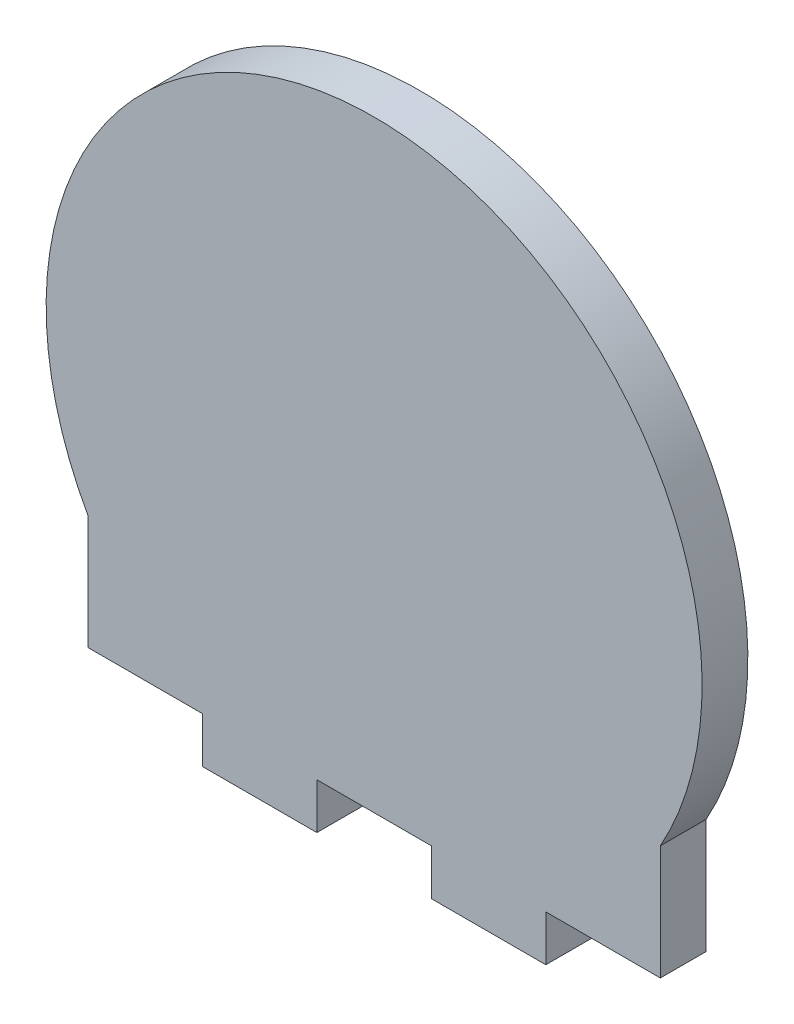
ISO-10303-21;
HEADER;
FILE_DESCRIPTION(('STEP AP214'),'2;1');
FILE_NAME('part.step','',(''),(''),'','','');
FILE_SCHEMA(('AUTOMOTIVE_DESIGN { 1 0 10303 214 1 1 1 1 }'));
ENDSEC;
DATA;
#1=APPLICATION_CONTEXT('core data for automotive mechanical design processes');
#2=APPLICATION_PROTOCOL_DEFINITION('international standard','automotive_design',2000,#1);
#3=PRODUCT_CONTEXT('',#1,'mechanical');
#4=PRODUCT('Part','Part','',(#3));
#5=PRODUCT_RELATED_PRODUCT_CATEGORY('part','',(#4));
#6=PRODUCT_DEFINITION_FORMATION('','',#4);
#7=PRODUCT_DEFINITION_CONTEXT('part definition',#1,'design');
#8=PRODUCT_DEFINITION('design','',#6,#7);
#9=PRODUCT_DEFINITION_SHAPE('','',#8);
#10=(LENGTH_UNIT() NAMED_UNIT(*) SI_UNIT(.MILLI.,.METRE.));
#11=(NAMED_UNIT(*) PLANE_ANGLE_UNIT() SI_UNIT($,.RADIAN.));
#12=(NAMED_UNIT(*) SI_UNIT($,.STERADIAN.) SOLID_ANGLE_UNIT());
#13=UNCERTAINTY_MEASURE_WITH_UNIT(LENGTH_MEASURE(1.E-05),#10,'distance_accuracy_value','');
#14=(GEOMETRIC_REPRESENTATION_CONTEXT(3) GLOBAL_UNCERTAINTY_ASSIGNED_CONTEXT((#13)) GLOBAL_UNIT_ASSIGNED_CONTEXT((#10,
#11,#12)) REPRESENTATION_CONTEXT('',''));
#15=CARTESIAN_POINT('',(0.,0.,0.));
#16=DIRECTION('',(0.,0.,1.));
#17=DIRECTION('',(1.,0.,0.));
#18=AXIS2_PLACEMENT_3D('',#15,#16,#17);
#19=CARTESIAN_POINT('',(0.,10.,4.));
#20=DIRECTION('',(1.,0.,0.));
#21=DIRECTION('',(0.,1.,0.));
#22=AXIS2_PLACEMENT_3D('',#19,#20,#21);
#23=PLANE('',#22);
#24=DIRECTION('',(0.,-1.,0.));
#25=VECTOR('',#24,1.);
#26=CARTESIAN_POINT('',(0.,10.,0.));
#27=LINE('',#26,#25);
#28=CARTESIAN_POINT('',(0.,10.,0.));
#29=VERTEX_POINT('',#28);
#30=CARTESIAN_POINT('',(0.,0.,0.));
#31=VERTEX_POINT('',#30);
#32=EDGE_CURVE('E151',#29,#31,#27,.T.);
#33=ORIENTED_EDGE('',*,*,#32,.T.);
#34=DIRECTION('',(0.,0.,-1.));
#35=VECTOR('',#34,1.);
#36=CARTESIAN_POINT('',(0.,0.,4.));
#37=LINE('',#36,#35);
#38=CARTESIAN_POINT('',(0.,0.,4.));
#39=VERTEX_POINT('',#38);
#40=EDGE_CURVE('E11',#39,#31,#37,.T.);
#41=ORIENTED_EDGE('',*,*,#40,.F.);
#42=DIRECTION('',(0.,-1.,0.));
#43=VECTOR('',#42,1.);
#44=CARTESIAN_POINT('',(0.,10.,4.));
#45=LINE('',#44,#43);
#46=CARTESIAN_POINT('',(0.,10.,4.));
#47=VERTEX_POINT('',#46);
#48=EDGE_CURVE('E173',#47,#39,#45,.T.);
#49=ORIENTED_EDGE('',*,*,#48,.F.);
#50=DIRECTION('',(0.,0.,-1.));
#51=VECTOR('',#50,1.);
#52=CARTESIAN_POINT('',(0.,10.,4.));
#53=LINE('',#52,#51);
#54=EDGE_CURVE('E147',#47,#29,#53,.T.);
#55=ORIENTED_EDGE('',*,*,#54,.T.);
#56=EDGE_LOOP('',(#33,#41,#49,#55));
#57=FACE_BOUND('',#56,.T.);
#58=ADVANCED_FACE('F31',(#57),#23,.F.);
#59=CARTESIAN_POINT('',(0.,0.,4.));
#60=DIRECTION('',(0.,1.,0.));
#61=DIRECTION('',(0.,0.,1.));
#62=AXIS2_PLACEMENT_3D('',#59,#60,#61);
#63=PLANE('',#62);
#64=DIRECTION('',(1.,0.,0.));
#65=VECTOR('',#64,1.);
#66=CARTESIAN_POINT('',(0.,0.,0.));
#67=LINE('',#66,#65);
#68=CARTESIAN_POINT('',(10.,0.,0.));
#69=VERTEX_POINT('',#68);
#70=EDGE_CURVE('E154',#31,#69,#67,.T.);
#71=ORIENTED_EDGE('',*,*,#70,.T.);
#72=DIRECTION('',(0.,0.,-1.));
#73=VECTOR('',#72,1.);
#74=CARTESIAN_POINT('',(10.,0.,4.));
#75=LINE('',#74,#73);
#76=CARTESIAN_POINT('',(10.,0.,4.));
#77=VERTEX_POINT('',#76);
#78=EDGE_CURVE('E39',#77,#69,#75,.T.);
#79=ORIENTED_EDGE('',*,*,#78,.F.);
#80=DIRECTION('',(1.,0.,0.));
#81=VECTOR('',#80,1.);
#82=CARTESIAN_POINT('',(0.,0.,4.));
#83=LINE('',#82,#81);
#84=EDGE_CURVE('E102',#39,#77,#83,.T.);
#85=ORIENTED_EDGE('',*,*,#84,.F.);
#86=ORIENTED_EDGE('',*,*,#40,.T.);
#87=EDGE_LOOP('',(#71,#79,#85,#86));
#88=FACE_BOUND('',#87,.T.);
#89=ADVANCED_FACE('F251',(#88),#63,.F.);
#90=CARTESIAN_POINT('',(10.,0.,4.));
#91=DIRECTION('',(1.,0.,0.));
#92=DIRECTION('',(0.,1.,0.));
#93=AXIS2_PLACEMENT_3D('',#90,#91,#92);
#94=PLANE('',#93);
#95=DIRECTION('',(0.,-1.,0.));
#96=VECTOR('',#95,1.);
#97=CARTESIAN_POINT('',(10.,0.,0.));
#98=LINE('',#97,#96);
#99=CARTESIAN_POINT('',(10.,-4.,0.));
#100=VERTEX_POINT('',#99);
#101=EDGE_CURVE('E156',#69,#100,#98,.T.);
#102=ORIENTED_EDGE('',*,*,#101,.T.);
#103=DIRECTION('',(0.,0.,-1.));
#104=VECTOR('',#103,1.);
#105=CARTESIAN_POINT('',(10.,-4.,4.));
#106=LINE('',#105,#104);
#107=CARTESIAN_POINT('',(10.,-4.,4.));
#108=VERTEX_POINT('',#107);
#109=EDGE_CURVE('E192',#108,#100,#106,.T.);
#110=ORIENTED_EDGE('',*,*,#109,.F.);
#111=DIRECTION('',(0.,-1.,0.));
#112=VECTOR('',#111,1.);
#113=CARTESIAN_POINT('',(10.,0.,4.));
#114=LINE('',#113,#112);
#115=EDGE_CURVE('E200',#77,#108,#114,.T.);
#116=ORIENTED_EDGE('',*,*,#115,.F.);
#117=ORIENTED_EDGE('',*,*,#78,.T.);
#118=EDGE_LOOP('',(#102,#110,#116,#117));
#119=FACE_BOUND('',#118,.T.);
#120=ADVANCED_FACE('F198',(#119),#94,.F.);
#121=CARTESIAN_POINT('',(10.,-4.,4.));
#122=DIRECTION('',(0.,1.,0.));
#123=DIRECTION('',(0.,0.,1.));
#124=AXIS2_PLACEMENT_3D('',#121,#122,#123);
#125=PLANE('',#124);
#126=DIRECTION('',(1.,0.,0.));
#127=VECTOR('',#126,1.);
#128=CARTESIAN_POINT('',(10.,-4.,0.));
#129=LINE('',#128,#127);
#130=CARTESIAN_POINT('',(20.,-4.,0.));
#131=VERTEX_POINT('',#130);
#132=EDGE_CURVE('E158',#100,#131,#129,.T.);
#133=ORIENTED_EDGE('',*,*,#132,.T.);
#134=DIRECTION('',(0.,0.,-1.));
#135=VECTOR('',#134,1.);
#136=CARTESIAN_POINT('',(20.,-4.,4.));
#137=LINE('',#136,#135);
#138=CARTESIAN_POINT('',(20.,-4.,4.));
#139=VERTEX_POINT('',#138);
#140=EDGE_CURVE('E189',#139,#131,#137,.T.);
#141=ORIENTED_EDGE('',*,*,#140,.F.);
#142=DIRECTION('',(1.,0.,0.));
#143=VECTOR('',#142,1.);
#144=CARTESIAN_POINT('',(10.,-4.,4.));
#145=LINE('',#144,#143);
#146=EDGE_CURVE('E218',#108,#139,#145,.T.);
#147=ORIENTED_EDGE('',*,*,#146,.F.);
#148=ORIENTED_EDGE('',*,*,#109,.T.);
#149=EDGE_LOOP('',(#133,#141,#147,#148));
#150=FACE_BOUND('',#149,.T.);
#151=ADVANCED_FACE('F209',(#150),#125,.F.);
#152=CARTESIAN_POINT('',(20.,-4.,4.));
#153=DIRECTION('',(-1.,0.,0.));
#154=DIRECTION('',(0.,0.,1.));
#155=AXIS2_PLACEMENT_3D('',#152,#153,#154);
#156=PLANE('',#155);
#157=DIRECTION('',(0.,1.,0.));
#158=VECTOR('',#157,1.);
#159=CARTESIAN_POINT('',(20.,-4.,0.));
#160=LINE('',#159,#158);
#161=CARTESIAN_POINT('',(20.,0.,0.));
#162=VERTEX_POINT('',#161);
#163=EDGE_CURVE('E160',#131,#162,#160,.T.);
#164=ORIENTED_EDGE('',*,*,#163,.T.);
#165=DIRECTION('',(0.,0.,-1.));
#166=VECTOR('',#165,1.);
#167=CARTESIAN_POINT('',(20.,0.,4.));
#168=LINE('',#167,#166);
#169=CARTESIAN_POINT('',(20.,0.,4.));
#170=VERTEX_POINT('',#169);
#171=EDGE_CURVE('E186',#170,#162,#168,.T.);
#172=ORIENTED_EDGE('',*,*,#171,.F.);
#173=DIRECTION('',(0.,1.,0.));
#174=VECTOR('',#173,1.);
#175=CARTESIAN_POINT('',(20.,-4.,4.));
#176=LINE('',#175,#174);
#177=EDGE_CURVE('E215',#139,#170,#176,.T.);
#178=ORIENTED_EDGE('',*,*,#177,.F.);
#179=ORIENTED_EDGE('',*,*,#140,.T.);
#180=EDGE_LOOP('',(#164,#172,#178,#179));
#181=FACE_BOUND('',#180,.T.);
#182=ADVANCED_FACE('F213',(#181),#156,.F.);
#183=CARTESIAN_POINT('',(20.,0.,4.));
#184=DIRECTION('',(0.,1.,0.));
#185=DIRECTION('',(0.,0.,1.));
#186=AXIS2_PLACEMENT_3D('',#183,#184,#185);
#187=PLANE('',#186);
#188=DIRECTION('',(1.,0.,0.));
#189=VECTOR('',#188,1.);
#190=CARTESIAN_POINT('',(20.,0.,0.));
#191=LINE('',#190,#189);
#192=CARTESIAN_POINT('',(30.,0.,0.));
#193=VERTEX_POINT('',#192);
#194=EDGE_CURVE('E162',#162,#193,#191,.T.);
#195=ORIENTED_EDGE('',*,*,#194,.T.);
#196=DIRECTION('',(0.,0.,-1.));
#197=VECTOR('',#196,1.);
#198=CARTESIAN_POINT('',(30.,0.,4.));
#199=LINE('',#198,#197);
#200=CARTESIAN_POINT('',(30.,0.,4.));
#201=VERTEX_POINT('',#200);
#202=EDGE_CURVE('E183',#201,#193,#199,.T.);
#203=ORIENTED_EDGE('',*,*,#202,.F.);
#204=DIRECTION('',(1.,0.,0.));
#205=VECTOR('',#204,1.);
#206=CARTESIAN_POINT('',(20.,0.,4.));
#207=LINE('',#206,#205);
#208=EDGE_CURVE('E217',#170,#201,#207,.T.);
#209=ORIENTED_EDGE('',*,*,#208,.F.);
#210=ORIENTED_EDGE('',*,*,#171,.T.);
#211=EDGE_LOOP('',(#195,#203,#209,#210));
#212=FACE_BOUND('',#211,.T.);
#213=ADVANCED_FACE('F264',(#212),#187,.F.);
#214=CARTESIAN_POINT('',(30.,0.,4.));
#215=DIRECTION('',(1.,0.,0.));
#216=DIRECTION('',(0.,0.,-1.));
#217=AXIS2_PLACEMENT_3D('',#214,#215,#216);
#218=PLANE('',#217);
#219=DIRECTION('',(0.,-1.,0.));
#220=VECTOR('',#219,1.);
#221=CARTESIAN_POINT('',(30.,0.,0.));
#222=LINE('',#221,#220);
#223=CARTESIAN_POINT('',(30.,-4.,0.));
#224=VERTEX_POINT('',#223);
#225=EDGE_CURVE('E164',#193,#224,#222,.T.);
#226=ORIENTED_EDGE('',*,*,#225,.T.);
#227=DIRECTION('',(0.,0.,-1.));
#228=VECTOR('',#227,1.);
#229=CARTESIAN_POINT('',(30.,-4.,4.));
#230=LINE('',#229,#228);
#231=CARTESIAN_POINT('',(30.,-4.,4.));
#232=VERTEX_POINT('',#231);
#233=EDGE_CURVE('E180',#232,#224,#230,.T.);
#234=ORIENTED_EDGE('',*,*,#233,.F.);
#235=DIRECTION('',(0.,-1.,0.));
#236=VECTOR('',#235,1.);
#237=CARTESIAN_POINT('',(30.,0.,4.));
#238=LINE('',#237,#236);
#239=EDGE_CURVE('E220',#201,#232,#238,.T.);
#240=ORIENTED_EDGE('',*,*,#239,.F.);
#241=ORIENTED_EDGE('',*,*,#202,.T.);
#242=EDGE_LOOP('',(#226,#234,#240,#241));
#243=FACE_BOUND('',#242,.T.);
#244=ADVANCED_FACE('F267',(#243),#218,.F.);
#245=CARTESIAN_POINT('',(30.,-4.,4.));
#246=DIRECTION('',(0.,1.,0.));
#247=DIRECTION('',(0.,0.,1.));
#248=AXIS2_PLACEMENT_3D('',#245,#246,#247);
#249=PLANE('',#248);
#250=DIRECTION('',(1.,0.,0.));
#251=VECTOR('',#250,1.);
#252=CARTESIAN_POINT('',(30.,-4.,0.));
#253=LINE('',#252,#251);
#254=CARTESIAN_POINT('',(40.,-4.,0.));
#255=VERTEX_POINT('',#254);
#256=EDGE_CURVE('E166',#224,#255,#253,.T.);
#257=ORIENTED_EDGE('',*,*,#256,.T.);
#258=DIRECTION('',(0.,0.,-1.));
#259=VECTOR('',#258,1.);
#260=CARTESIAN_POINT('',(40.,-4.,4.));
#261=LINE('',#260,#259);
#262=CARTESIAN_POINT('',(40.,-4.,4.));
#263=VERTEX_POINT('',#262);
#264=EDGE_CURVE('E177',#263,#255,#261,.T.);
#265=ORIENTED_EDGE('',*,*,#264,.F.);
#266=DIRECTION('',(1.,0.,0.));
#267=VECTOR('',#266,1.);
#268=CARTESIAN_POINT('',(30.,-4.,4.));
#269=LINE('',#268,#267);
#270=EDGE_CURVE('E226',#232,#263,#269,.T.);
#271=ORIENTED_EDGE('',*,*,#270,.F.);
#272=ORIENTED_EDGE('',*,*,#233,.T.);
#273=EDGE_LOOP('',(#257,#265,#271,#272));
#274=FACE_BOUND('',#273,.T.);
#275=ADVANCED_FACE('F232',(#274),#249,.F.);
#276=CARTESIAN_POINT('',(40.,-4.,4.));
#277=DIRECTION('',(-1.,0.,0.));
#278=DIRECTION('',(0.,0.,1.));
#279=AXIS2_PLACEMENT_3D('',#276,#277,#278);
#280=PLANE('',#279);
#281=DIRECTION('',(0.,1.,0.));
#282=VECTOR('',#281,1.);
#283=CARTESIAN_POINT('',(40.,-4.,0.));
#284=LINE('',#283,#282);
#285=CARTESIAN_POINT('',(40.,0.,0.));
#286=VERTEX_POINT('',#285);
#287=EDGE_CURVE('E168',#255,#286,#284,.T.);
#288=ORIENTED_EDGE('',*,*,#287,.T.);
#289=DIRECTION('',(0.,0.,-1.));
#290=VECTOR('',#289,1.);
#291=CARTESIAN_POINT('',(40.,0.,4.));
#292=LINE('',#291,#290);
#293=CARTESIAN_POINT('',(40.,0.,4.));
#294=VERTEX_POINT('',#293);
#295=EDGE_CURVE('E142',#294,#286,#292,.T.);
#296=ORIENTED_EDGE('',*,*,#295,.F.);
#297=DIRECTION('',(0.,1.,0.));
#298=VECTOR('',#297,1.);
#299=CARTESIAN_POINT('',(40.,-4.,4.));
#300=LINE('',#299,#298);
#301=EDGE_CURVE('E133',#263,#294,#300,.T.);
#302=ORIENTED_EDGE('',*,*,#301,.F.);
#303=ORIENTED_EDGE('',*,*,#264,.T.);
#304=EDGE_LOOP('',(#288,#296,#302,#303));
#305=FACE_BOUND('',#304,.T.);
#306=ADVANCED_FACE('F236',(#305),#280,.F.);
#307=CARTESIAN_POINT('',(40.,0.,4.));
#308=DIRECTION('',(0.,1.,0.));
#309=DIRECTION('',(0.,0.,1.));
#310=AXIS2_PLACEMENT_3D('',#307,#308,#309);
#311=PLANE('',#310);
#312=DIRECTION('',(1.,0.,0.));
#313=VECTOR('',#312,1.);
#314=CARTESIAN_POINT('',(40.,0.,0.));
#315=LINE('',#314,#313);
#316=CARTESIAN_POINT('',(50.,0.,0.));
#317=VERTEX_POINT('',#316);
#318=EDGE_CURVE('E141',#286,#317,#315,.T.);
#319=ORIENTED_EDGE('',*,*,#318,.T.);
#320=DIRECTION('',(0.,0.,-1.));
#321=VECTOR('',#320,1.);
#322=CARTESIAN_POINT('',(50.,0.,4.));
#323=LINE('',#322,#321);
#324=CARTESIAN_POINT('',(50.,0.,4.));
#325=VERTEX_POINT('',#324);
#326=EDGE_CURVE('E138',#325,#317,#323,.T.);
#327=ORIENTED_EDGE('',*,*,#326,.F.);
#328=DIRECTION('',(1.,0.,0.));
#329=VECTOR('',#328,1.);
#330=CARTESIAN_POINT('',(40.,0.,4.));
#331=LINE('',#330,#329);
#332=EDGE_CURVE('E127',#294,#325,#331,.T.);
#333=ORIENTED_EDGE('',*,*,#332,.F.);
#334=ORIENTED_EDGE('',*,*,#295,.T.);
#335=EDGE_LOOP('',(#319,#327,#333,#334));
#336=FACE_BOUND('',#335,.T.);
#337=ADVANCED_FACE('F139',(#336),#311,.F.);
#338=CARTESIAN_POINT('',(50.,0.,4.));
#339=DIRECTION('',(-1.,0.,0.));
#340=DIRECTION('',(0.,0.,1.));
#341=AXIS2_PLACEMENT_3D('',#338,#339,#340);
#342=PLANE('',#341);
#343=DIRECTION('',(0.,1.,0.));
#344=VECTOR('',#343,1.);
#345=CARTESIAN_POINT('',(50.,0.,0.));
#346=LINE('',#345,#344);
#347=CARTESIAN_POINT('',(50.,10.,0.));
#348=VERTEX_POINT('',#347);
#349=EDGE_CURVE('E88',#317,#348,#346,.T.);
#350=ORIENTED_EDGE('',*,*,#349,.T.);
#351=DIRECTION('',(0.,0.,-1.));
#352=VECTOR('',#351,1.);
#353=CARTESIAN_POINT('',(50.,10.,4.));
#354=LINE('',#353,#352);
#355=CARTESIAN_POINT('',(50.,10.,4.));
#356=VERTEX_POINT('',#355);
#357=EDGE_CURVE('E143',#356,#348,#354,.T.);
#358=ORIENTED_EDGE('',*,*,#357,.F.);
#359=DIRECTION('',(0.,1.,0.));
#360=VECTOR('',#359,1.);
#361=CARTESIAN_POINT('',(50.,0.,4.));
#362=LINE('',#361,#360);
#363=EDGE_CURVE('E131',#325,#356,#362,.T.);
#364=ORIENTED_EDGE('',*,*,#363,.F.);
#365=ORIENTED_EDGE('',*,*,#326,.T.);
#366=EDGE_LOOP('',(#350,#358,#364,#365));
#367=FACE_BOUND('',#366,.T.);
#368=ADVANCED_FACE('F145',(#367),#342,.F.);
#369=CARTESIAN_POINT('',(25.,23.9861301257621,4.));
#370=DIRECTION('',(0.,0.,-1.));
#371=DIRECTION('',(-1.,0.,0.));
#372=AXIS2_PLACEMENT_3D('',#369,#370,#371);
#373=CYLINDRICAL_SURFACE('',#372,28.6463232526401);
#374=CARTESIAN_POINT('',(25.,23.9861301257621,0.));
#375=DIRECTION('',(0.,0.,1.));
#376=DIRECTION('',(-1.,0.,0.));
#377=AXIS2_PLACEMENT_3D('',#374,#375,#376);
#378=CIRCLE('',#377,28.6463232526401);
#379=EDGE_CURVE('E94',#348,#29,#378,.T.);
#380=ORIENTED_EDGE('',*,*,#379,.T.);
#381=ORIENTED_EDGE('',*,*,#54,.F.);
#382=CARTESIAN_POINT('',(25.,23.9861301257621,4.));
#383=DIRECTION('',(0.,0.,1.));
#384=DIRECTION('',(-1.,0.,0.));
#385=AXIS2_PLACEMENT_3D('',#382,#383,#384);
#386=CIRCLE('',#385,28.6463232526401);
#387=EDGE_CURVE('E47',#356,#47,#386,.T.);
#388=ORIENTED_EDGE('',*,*,#387,.F.);
#389=ORIENTED_EDGE('',*,*,#357,.T.);
#390=EDGE_LOOP('',(#380,#381,#388,#389));
#391=FACE_BOUND('',#390,.T.);
#392=ADVANCED_FACE('F240',(#391),#373,.T.);
#393=CARTESIAN_POINT('',(25.,23.9861301257621,4.));
#394=DIRECTION('',(0.,0.,-1.));
#395=DIRECTION('',(-1.,0.,0.));
#396=AXIS2_PLACEMENT_3D('',#393,#394,#395);
#397=PLANE('',#396);
#398=ORIENTED_EDGE('',*,*,#48,.T.);
#399=ORIENTED_EDGE('',*,*,#84,.T.);
#400=ORIENTED_EDGE('',*,*,#115,.T.);
#401=ORIENTED_EDGE('',*,*,#146,.T.);
#402=ORIENTED_EDGE('',*,*,#177,.T.);
#403=ORIENTED_EDGE('',*,*,#208,.T.);
#404=ORIENTED_EDGE('',*,*,#239,.T.);
#405=ORIENTED_EDGE('',*,*,#270,.T.);
#406=ORIENTED_EDGE('',*,*,#301,.T.);
#407=ORIENTED_EDGE('',*,*,#332,.T.);
#408=ORIENTED_EDGE('',*,*,#363,.T.);
#409=ORIENTED_EDGE('',*,*,#387,.T.);
#410=EDGE_LOOP('',(#398,#399,#400,#401,#402,#403,#404,#405,#406,#407,#408,#409));
#411=FACE_BOUND('',#410,.T.);
#412=ADVANCED_FACE('F129',(#411),#397,.F.);
#413=CARTESIAN_POINT('',(25.,23.9861301257621,0.));
#414=DIRECTION('',(0.,0.,-1.));
#415=DIRECTION('',(-1.,0.,0.));
#416=AXIS2_PLACEMENT_3D('',#413,#414,#415);
#417=PLANE('',#416);
#418=ORIENTED_EDGE('',*,*,#32,.F.);
#419=ORIENTED_EDGE('',*,*,#379,.F.);
#420=ORIENTED_EDGE('',*,*,#349,.F.);
#421=ORIENTED_EDGE('',*,*,#318,.F.);
#422=ORIENTED_EDGE('',*,*,#287,.F.);
#423=ORIENTED_EDGE('',*,*,#256,.F.);
#424=ORIENTED_EDGE('',*,*,#225,.F.);
#425=ORIENTED_EDGE('',*,*,#194,.F.);
#426=ORIENTED_EDGE('',*,*,#163,.F.);
#427=ORIENTED_EDGE('',*,*,#132,.F.);
#428=ORIENTED_EDGE('',*,*,#101,.F.);
#429=ORIENTED_EDGE('',*,*,#70,.F.);
#430=EDGE_LOOP('',(#418,#419,#420,#421,#422,#423,#424,#425,#426,#427,#428,#429));
#431=FACE_BOUND('',#430,.T.);
#432=ADVANCED_FACE('F204',(#431),#417,.T.);
#433=CLOSED_SHELL('',(#58,#89,#120,#151,#182,#213,#244,#275,#306,#337,#368,#392,#412,#432));
#434=MANIFOLD_SOLID_BREP('B2',#433);
#435=ADVANCED_BREP_SHAPE_REPRESENTATION('',(#18,#434),#14);
#436=SHAPE_DEFINITION_REPRESENTATION(#9,#435);
ENDSEC;
END-ISO-10303-21;
